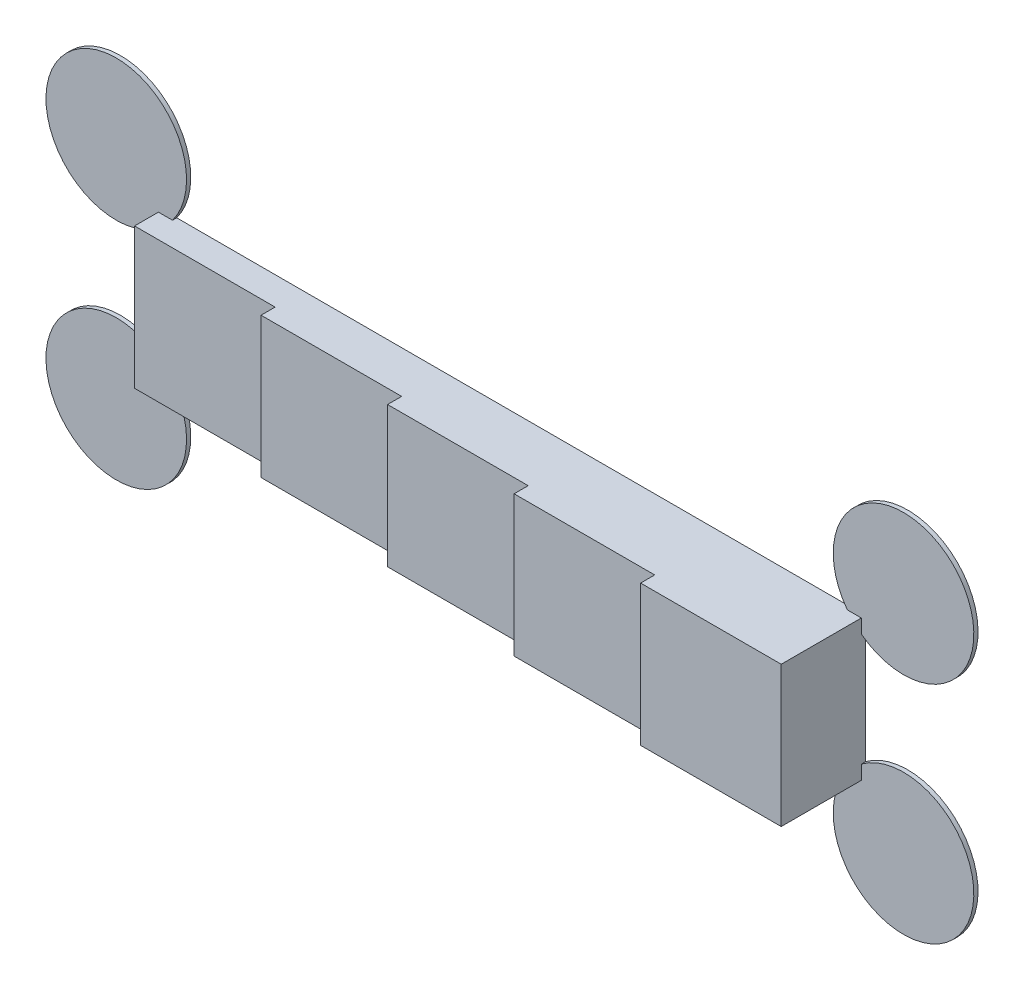
ISO-10303-21;
HEADER;
FILE_DESCRIPTION(('STEP AP214'),'2;1');
FILE_NAME('part.step','',(''),(''),'','','');
FILE_SCHEMA(('AUTOMOTIVE_DESIGN { 1 0 10303 214 1 1 1 1 }'));
ENDSEC;
DATA;
#1=APPLICATION_CONTEXT('core data for automotive mechanical design processes');
#2=APPLICATION_PROTOCOL_DEFINITION('international standard','automotive_design',2000,#1);
#3=PRODUCT_CONTEXT('',#1,'mechanical');
#4=PRODUCT('Part','Part','',(#3));
#5=PRODUCT_RELATED_PRODUCT_CATEGORY('part','',(#4));
#6=PRODUCT_DEFINITION_FORMATION('','',#4);
#7=PRODUCT_DEFINITION_CONTEXT('part definition',#1,'design');
#8=PRODUCT_DEFINITION('design','',#6,#7);
#9=PRODUCT_DEFINITION_SHAPE('','',#8);
#10=(LENGTH_UNIT() NAMED_UNIT(*) SI_UNIT(.MILLI.,.METRE.));
#11=(NAMED_UNIT(*) PLANE_ANGLE_UNIT() SI_UNIT($,.RADIAN.));
#12=(NAMED_UNIT(*) SI_UNIT($,.STERADIAN.) SOLID_ANGLE_UNIT());
#13=UNCERTAINTY_MEASURE_WITH_UNIT(LENGTH_MEASURE(1.E-05),#10,'distance_accuracy_value','');
#14=(GEOMETRIC_REPRESENTATION_CONTEXT(3) GLOBAL_UNCERTAINTY_ASSIGNED_CONTEXT((#13)) GLOBAL_UNIT_ASSIGNED_CONTEXT((#10,
#11,#12)) REPRESENTATION_CONTEXT('',''));
#15=CARTESIAN_POINT('',(0.,0.,0.));
#16=DIRECTION('',(0.,0.,1.));
#17=DIRECTION('',(1.,0.,0.));
#18=AXIS2_PLACEMENT_3D('',#15,#16,#17);
#19=CARTESIAN_POINT('',(0.,0.,5.));
#20=DIRECTION('',(0.,0.,-1.));
#21=DIRECTION('',(-1.,0.,0.));
#22=AXIS2_PLACEMENT_3D('',#19,#20,#21);
#23=PLANE('',#22);
#24=DIRECTION('',(0.,-1.,0.));
#25=VECTOR('',#24,1.);
#26=CARTESIAN_POINT('',(40.,10.,5.));
#27=LINE('',#26,#25);
#28=CARTESIAN_POINT('',(40.,10.,5.));
#29=VERTEX_POINT('',#28);
#30=CARTESIAN_POINT('',(40.,0.,5.));
#31=VERTEX_POINT('',#30);
#32=EDGE_CURVE('E233',#29,#31,#27,.T.);
#33=ORIENTED_EDGE('',*,*,#32,.F.);
#34=DIRECTION('',(-1.,0.,0.));
#35=VECTOR('',#34,1.);
#36=CARTESIAN_POINT('',(50.,10.,5.));
#37=LINE('',#36,#35);
#38=CARTESIAN_POINT('',(30.,10.,5.));
#39=VERTEX_POINT('',#38);
#40=EDGE_CURVE('E289',#29,#39,#37,.T.);
#41=ORIENTED_EDGE('',*,*,#40,.T.);
#42=DIRECTION('',(0.,-1.,0.));
#43=VECTOR('',#42,1.);
#44=CARTESIAN_POINT('',(30.,10.,5.));
#45=LINE('',#44,#43);
#46=CARTESIAN_POINT('',(30.,0.,5.));
#47=VERTEX_POINT('',#46);
#48=EDGE_CURVE('E303',#39,#47,#45,.T.);
#49=ORIENTED_EDGE('',*,*,#48,.T.);
#50=DIRECTION('',(1.,0.,0.));
#51=VECTOR('',#50,1.);
#52=CARTESIAN_POINT('',(50.,0.,5.));
#53=LINE('',#52,#51);
#54=EDGE_CURVE('E299',#47,#31,#53,.T.);
#55=ORIENTED_EDGE('',*,*,#54,.T.);
#56=EDGE_LOOP('',(#33,#41,#49,#55));
#57=FACE_BOUND('',#56,.T.);
#58=ADVANCED_FACE('F33',(#57),#23,.F.);
#59=CARTESIAN_POINT('',(0.,0.,4.));
#60=DIRECTION('',(0.,0.,-1.));
#61=DIRECTION('',(-1.,0.,0.));
#62=AXIS2_PLACEMENT_3D('',#59,#60,#61);
#63=PLANE('',#62);
#64=DIRECTION('',(0.,-1.,0.));
#65=VECTOR('',#64,1.);
#66=CARTESIAN_POINT('',(30.,10.,4.));
#67=LINE('',#66,#65);
#68=CARTESIAN_POINT('',(30.,10.,4.));
#69=VERTEX_POINT('',#68);
#70=CARTESIAN_POINT('',(30.,0.,4.));
#71=VERTEX_POINT('',#70);
#72=EDGE_CURVE('E295',#69,#71,#67,.T.);
#73=ORIENTED_EDGE('',*,*,#72,.F.);
#74=DIRECTION('',(-1.,0.,0.));
#75=VECTOR('',#74,1.);
#76=CARTESIAN_POINT('',(50.,10.,4.));
#77=LINE('',#76,#75);
#78=CARTESIAN_POINT('',(20.,10.,4.));
#79=VERTEX_POINT('',#78);
#80=EDGE_CURVE('E327',#69,#79,#77,.T.);
#81=ORIENTED_EDGE('',*,*,#80,.T.);
#82=DIRECTION('',(0.,-1.,0.));
#83=VECTOR('',#82,1.);
#84=CARTESIAN_POINT('',(20.,10.,4.));
#85=LINE('',#84,#83);
#86=CARTESIAN_POINT('',(20.,0.,4.));
#87=VERTEX_POINT('',#86);
#88=EDGE_CURVE('E333',#79,#87,#85,.T.);
#89=ORIENTED_EDGE('',*,*,#88,.T.);
#90=DIRECTION('',(1.,0.,0.));
#91=VECTOR('',#90,1.);
#92=CARTESIAN_POINT('',(50.,0.,4.));
#93=LINE('',#92,#91);
#94=EDGE_CURVE('E313',#87,#71,#93,.T.);
#95=ORIENTED_EDGE('',*,*,#94,.T.);
#96=EDGE_LOOP('',(#73,#81,#89,#95));
#97=FACE_BOUND('',#96,.T.);
#98=ADVANCED_FACE('F423',(#97),#63,.F.);
#99=CARTESIAN_POINT('',(0.,0.,3.));
#100=DIRECTION('',(0.,0.,-1.));
#101=DIRECTION('',(-1.,0.,0.));
#102=AXIS2_PLACEMENT_3D('',#99,#100,#101);
#103=PLANE('',#102);
#104=DIRECTION('',(0.,-1.,0.));
#105=VECTOR('',#104,1.);
#106=CARTESIAN_POINT('',(20.,10.,3.));
#107=LINE('',#106,#105);
#108=CARTESIAN_POINT('',(20.,9.99999999999999,3.));
#109=VERTEX_POINT('',#108);
#110=CARTESIAN_POINT('',(20.,0.,3.));
#111=VERTEX_POINT('',#110);
#112=EDGE_CURVE('E322',#109,#111,#107,.T.);
#113=ORIENTED_EDGE('',*,*,#112,.F.);
#114=DIRECTION('',(-1.,0.,0.));
#115=VECTOR('',#114,1.);
#116=CARTESIAN_POINT('',(50.,10.,3.));
#117=LINE('',#116,#115);
#118=CARTESIAN_POINT('',(10.,9.99999999999999,3.));
#119=VERTEX_POINT('',#118);
#120=EDGE_CURVE('E348',#109,#119,#117,.T.);
#121=ORIENTED_EDGE('',*,*,#120,.T.);
#122=DIRECTION('',(0.,-1.,0.));
#123=VECTOR('',#122,1.);
#124=CARTESIAN_POINT('',(10.,9.99999999999999,3.));
#125=LINE('',#124,#123);
#126=CARTESIAN_POINT('',(10.,0.,3.));
#127=VERTEX_POINT('',#126);
#128=EDGE_CURVE('E347',#119,#127,#125,.T.);
#129=ORIENTED_EDGE('',*,*,#128,.T.);
#130=DIRECTION('',(1.,0.,0.));
#131=VECTOR('',#130,1.);
#132=CARTESIAN_POINT('',(50.,0.,3.));
#133=LINE('',#132,#131);
#134=EDGE_CURVE('E337',#127,#111,#133,.T.);
#135=ORIENTED_EDGE('',*,*,#134,.T.);
#136=EDGE_LOOP('',(#113,#121,#129,#135));
#137=FACE_BOUND('',#136,.T.);
#138=ADVANCED_FACE('F429',(#137),#103,.F.);
#139=CARTESIAN_POINT('',(0.,0.,2.));
#140=DIRECTION('',(0.,0.,-1.));
#141=DIRECTION('',(-1.,0.,0.));
#142=AXIS2_PLACEMENT_3D('',#139,#140,#141);
#143=PLANE('',#142);
#144=DIRECTION('',(0.,-1.,0.));
#145=VECTOR('',#144,1.);
#146=CARTESIAN_POINT('',(10.,9.99999999999999,2.));
#147=LINE('',#146,#145);
#148=CARTESIAN_POINT('',(10.,10.,2.));
#149=VERTEX_POINT('',#148);
#150=CARTESIAN_POINT('',(10.,0.,2.));
#151=VERTEX_POINT('',#150);
#152=EDGE_CURVE('E350',#149,#151,#147,.T.);
#153=ORIENTED_EDGE('',*,*,#152,.F.);
#154=DIRECTION('',(-1.,0.,0.));
#155=VECTOR('',#154,1.);
#156=CARTESIAN_POINT('',(0.,10.,2.));
#157=LINE('',#156,#155);
#158=CARTESIAN_POINT('',(0.,10.,2.));
#159=VERTEX_POINT('',#158);
#160=EDGE_CURVE('E366',#149,#159,#157,.T.);
#161=ORIENTED_EDGE('',*,*,#160,.T.);
#162=DIRECTION('',(0.,-1.,0.));
#163=VECTOR('',#162,1.);
#164=CARTESIAN_POINT('',(0.,0.,2.));
#165=LINE('',#164,#163);
#166=CARTESIAN_POINT('',(0.,0.,2.));
#167=VERTEX_POINT('',#166);
#168=EDGE_CURVE('E372',#159,#167,#165,.T.);
#169=ORIENTED_EDGE('',*,*,#168,.T.);
#170=DIRECTION('',(1.,0.,0.));
#171=VECTOR('',#170,1.);
#172=CARTESIAN_POINT('',(0.,0.,2.));
#173=LINE('',#172,#171);
#174=EDGE_CURVE('E375',#167,#151,#173,.T.);
#175=ORIENTED_EDGE('',*,*,#174,.T.);
#176=EDGE_LOOP('',(#153,#161,#169,#175));
#177=FACE_BOUND('',#176,.T.);
#178=ADVANCED_FACE('F404',(#177),#143,.F.);
#179=CARTESIAN_POINT('',(0.,0.,2.));
#180=DIRECTION('',(1.,0.,0.));
#181=DIRECTION('',(0.,0.,-1.));
#182=AXIS2_PLACEMENT_3D('',#179,#180,#181);
#183=PLANE('',#182);
#184=DIRECTION('',(0.,1.,0.));
#185=VECTOR('',#184,1.);
#186=CARTESIAN_POINT('',(0.,0.,0.3));
#187=LINE('',#186,#185);
#188=CARTESIAN_POINT('',(0.,9.,0.3));
#189=VERTEX_POINT('',#188);
#190=CARTESIAN_POINT('',(0.,10.,0.3));
#191=VERTEX_POINT('',#190);
#192=EDGE_CURVE('E216',#189,#191,#187,.T.);
#193=ORIENTED_EDGE('',*,*,#192,.F.);
#194=DIRECTION('',(0.,0.,-1.));
#195=VECTOR('',#194,1.);
#196=CARTESIAN_POINT('',(0.,9.,0.3));
#197=LINE('',#196,#195);
#198=CARTESIAN_POINT('',(0.,9.,0.));
#199=VERTEX_POINT('',#198);
#200=EDGE_CURVE('E214',#189,#199,#197,.T.);
#201=ORIENTED_EDGE('',*,*,#200,.T.);
#202=DIRECTION('',(0.,-1.,0.));
#203=VECTOR('',#202,1.);
#204=CARTESIAN_POINT('',(0.,0.,0.));
#205=LINE('',#204,#203);
#206=CARTESIAN_POINT('',(0.,0.999999999999999,0.));
#207=VERTEX_POINT('',#206);
#208=EDGE_CURVE('E356',#199,#207,#205,.T.);
#209=ORIENTED_EDGE('',*,*,#208,.T.);
#210=DIRECTION('',(0.,0.,-1.));
#211=VECTOR('',#210,1.);
#212=CARTESIAN_POINT('',(0.,0.999999999999999,0.3));
#213=LINE('',#212,#211);
#214=CARTESIAN_POINT('',(0.,0.999999999999999,0.3));
#215=VERTEX_POINT('',#214);
#216=EDGE_CURVE('E228',#207,#215,#213,.F.);
#217=ORIENTED_EDGE('',*,*,#216,.T.);
#218=DIRECTION('',(0.,1.,0.));
#219=VECTOR('',#218,1.);
#220=CARTESIAN_POINT('',(0.,0.,0.3));
#221=LINE('',#220,#219);
#222=CARTESIAN_POINT('',(0.,0.,0.3));
#223=VERTEX_POINT('',#222);
#224=EDGE_CURVE('E230',#223,#215,#221,.T.);
#225=ORIENTED_EDGE('',*,*,#224,.F.);
#226=DIRECTION('',(0.,0.,-1.));
#227=VECTOR('',#226,1.);
#228=CARTESIAN_POINT('',(0.,0.,2.));
#229=LINE('',#228,#227);
#230=EDGE_CURVE('E265',#167,#223,#229,.T.);
#231=ORIENTED_EDGE('',*,*,#230,.F.);
#232=ORIENTED_EDGE('',*,*,#168,.F.);
#233=DIRECTION('',(0.,0.,-1.));
#234=VECTOR('',#233,1.);
#235=CARTESIAN_POINT('',(0.,10.,2.));
#236=LINE('',#235,#234);
#237=EDGE_CURVE('E281',#159,#191,#236,.T.);
#238=ORIENTED_EDGE('',*,*,#237,.T.);
#239=EDGE_LOOP('',(#193,#201,#209,#217,#225,#231,#232,#238));
#240=FACE_BOUND('',#239,.T.);
#241=ADVANCED_FACE('F35',(#240),#183,.F.);
#242=CARTESIAN_POINT('',(0.,0.,2.));
#243=DIRECTION('',(0.,1.,0.));
#244=DIRECTION('',(0.,0.,1.));
#245=AXIS2_PLACEMENT_3D('',#242,#243,#244);
#246=PLANE('',#245);
#247=DIRECTION('',(1.,0.,0.));
#248=VECTOR('',#247,1.);
#249=CARTESIAN_POINT('',(0.,0.,0.));
#250=LINE('',#249,#248);
#251=CARTESIAN_POINT('',(0.999999999999999,0.,0.));
#252=VERTEX_POINT('',#251);
#253=CARTESIAN_POINT('',(49.,0.,0.));
#254=VERTEX_POINT('',#253);
#255=EDGE_CURVE('E178',#252,#254,#250,.T.);
#256=ORIENTED_EDGE('',*,*,#255,.T.);
#257=DIRECTION('',(0.,0.,-1.));
#258=VECTOR('',#257,1.);
#259=CARTESIAN_POINT('',(49.,0.,0.3));
#260=LINE('',#259,#258);
#261=CARTESIAN_POINT('',(49.,0.,0.3));
#262=VERTEX_POINT('',#261);
#263=EDGE_CURVE('E48',#254,#262,#260,.F.);
#264=ORIENTED_EDGE('',*,*,#263,.T.);
#265=DIRECTION('',(-1.,0.,0.));
#266=VECTOR('',#265,1.);
#267=CARTESIAN_POINT('',(0.,0.,0.3));
#268=LINE('',#267,#266);
#269=CARTESIAN_POINT('',(50.,0.,0.3));
#270=VERTEX_POINT('',#269);
#271=EDGE_CURVE('E192',#270,#262,#268,.T.);
#272=ORIENTED_EDGE('',*,*,#271,.F.);
#273=DIRECTION('',(0.,0.,-1.));
#274=VECTOR('',#273,1.);
#275=CARTESIAN_POINT('',(50.,0.,2.));
#276=LINE('',#275,#274);
#277=CARTESIAN_POINT('',(50.,0.,6.));
#278=VERTEX_POINT('',#277);
#279=EDGE_CURVE('E280',#278,#270,#276,.T.);
#280=ORIENTED_EDGE('',*,*,#279,.F.);
#281=DIRECTION('',(1.,0.,0.));
#282=VECTOR('',#281,1.);
#283=CARTESIAN_POINT('',(40.,0.,6.));
#284=LINE('',#283,#282);
#285=CARTESIAN_POINT('',(40.,0.,6.));
#286=VERTEX_POINT('',#285);
#287=EDGE_CURVE('E237',#286,#278,#284,.T.);
#288=ORIENTED_EDGE('',*,*,#287,.F.);
#289=DIRECTION('',(0.,0.,-1.));
#290=VECTOR('',#289,1.);
#291=CARTESIAN_POINT('',(40.,0.,6.));
#292=LINE('',#291,#290);
#293=EDGE_CURVE('E258',#286,#31,#292,.T.);
#294=ORIENTED_EDGE('',*,*,#293,.T.);
#295=ORIENTED_EDGE('',*,*,#54,.F.);
#296=DIRECTION('',(0.,0.,-1.));
#297=VECTOR('',#296,1.);
#298=CARTESIAN_POINT('',(30.,0.,5.));
#299=LINE('',#298,#297);
#300=EDGE_CURVE('E302',#47,#71,#299,.T.);
#301=ORIENTED_EDGE('',*,*,#300,.T.);
#302=ORIENTED_EDGE('',*,*,#94,.F.);
#303=DIRECTION('',(0.,0.,-1.));
#304=VECTOR('',#303,1.);
#305=CARTESIAN_POINT('',(20.,0.,4.));
#306=LINE('',#305,#304);
#307=EDGE_CURVE('E340',#87,#111,#306,.T.);
#308=ORIENTED_EDGE('',*,*,#307,.T.);
#309=ORIENTED_EDGE('',*,*,#134,.F.);
#310=DIRECTION('',(0.,0.,-1.));
#311=VECTOR('',#310,1.);
#312=CARTESIAN_POINT('',(10.,0.,3.));
#313=LINE('',#312,#311);
#314=EDGE_CURVE('E357',#127,#151,#313,.T.);
#315=ORIENTED_EDGE('',*,*,#314,.T.);
#316=ORIENTED_EDGE('',*,*,#174,.F.);
#317=ORIENTED_EDGE('',*,*,#230,.T.);
#318=DIRECTION('',(-1.,0.,0.));
#319=VECTOR('',#318,1.);
#320=CARTESIAN_POINT('',(0.,0.,0.3));
#321=LINE('',#320,#319);
#322=CARTESIAN_POINT('',(0.999999999999999,0.,0.3));
#323=VERTEX_POINT('',#322);
#324=EDGE_CURVE('E261',#323,#223,#321,.T.);
#325=ORIENTED_EDGE('',*,*,#324,.F.);
#326=DIRECTION('',(0.,0.,-1.));
#327=VECTOR('',#326,1.);
#328=CARTESIAN_POINT('',(0.999999999999999,0.,0.3));
#329=LINE('',#328,#327);
#330=EDGE_CURVE('E223',#323,#252,#329,.T.);
#331=ORIENTED_EDGE('',*,*,#330,.T.);
#332=EDGE_LOOP('',(#256,#264,#272,#280,#288,#294,#295,#301,#302,#308,#309,#315,#316,#317,#325,#331));
#333=FACE_BOUND('',#332,.T.);
#334=ADVANCED_FACE('F396',(#333),#246,.F.);
#335=CARTESIAN_POINT('',(50.,0.,2.));
#336=DIRECTION('',(-1.,0.,0.));
#337=DIRECTION('',(0.,0.,1.));
#338=AXIS2_PLACEMENT_3D('',#335,#336,#337);
#339=PLANE('',#338);
#340=DIRECTION('',(0.,-1.,0.));
#341=VECTOR('',#340,1.);
#342=CARTESIAN_POINT('',(50.,0.,0.3));
#343=LINE('',#342,#341);
#344=CARTESIAN_POINT('',(50.,0.999999999999999,0.3));
#345=VERTEX_POINT('',#344);
#346=EDGE_CURVE('E11',#345,#270,#343,.T.);
#347=ORIENTED_EDGE('',*,*,#346,.F.);
#348=DIRECTION('',(0.,0.,-1.));
#349=VECTOR('',#348,1.);
#350=CARTESIAN_POINT('',(50.,0.999999999999999,0.3));
#351=LINE('',#350,#349);
#352=CARTESIAN_POINT('',(50.,0.999999999999999,0.));
#353=VERTEX_POINT('',#352);
#354=EDGE_CURVE('E180',#345,#353,#351,.T.);
#355=ORIENTED_EDGE('',*,*,#354,.T.);
#356=DIRECTION('',(0.,1.,0.));
#357=VECTOR('',#356,1.);
#358=CARTESIAN_POINT('',(50.,0.,0.));
#359=LINE('',#358,#357);
#360=CARTESIAN_POINT('',(50.,9.,0.));
#361=VERTEX_POINT('',#360);
#362=EDGE_CURVE('E170',#353,#361,#359,.T.);
#363=ORIENTED_EDGE('',*,*,#362,.T.);
#364=DIRECTION('',(0.,0.,-1.));
#365=VECTOR('',#364,1.);
#366=CARTESIAN_POINT('',(50.,9.,0.3));
#367=LINE('',#366,#365);
#368=CARTESIAN_POINT('',(50.,9.,0.3));
#369=VERTEX_POINT('',#368);
#370=EDGE_CURVE('E201',#361,#369,#367,.F.);
#371=ORIENTED_EDGE('',*,*,#370,.T.);
#372=DIRECTION('',(0.,-1.,0.));
#373=VECTOR('',#372,1.);
#374=CARTESIAN_POINT('',(50.,0.,0.3));
#375=LINE('',#374,#373);
#376=CARTESIAN_POINT('',(50.,10.,0.3));
#377=VERTEX_POINT('',#376);
#378=EDGE_CURVE('E203',#377,#369,#375,.T.);
#379=ORIENTED_EDGE('',*,*,#378,.F.);
#380=DIRECTION('',(0.,0.,-1.));
#381=VECTOR('',#380,1.);
#382=CARTESIAN_POINT('',(50.,10.,2.));
#383=LINE('',#382,#381);
#384=CARTESIAN_POINT('',(50.,10.,6.));
#385=VERTEX_POINT('',#384);
#386=EDGE_CURVE('E276',#385,#377,#383,.T.);
#387=ORIENTED_EDGE('',*,*,#386,.F.);
#388=DIRECTION('',(0.,1.,0.));
#389=VECTOR('',#388,1.);
#390=CARTESIAN_POINT('',(50.,10.,6.));
#391=LINE('',#390,#389);
#392=EDGE_CURVE('E240',#278,#385,#391,.T.);
#393=ORIENTED_EDGE('',*,*,#392,.F.);
#394=ORIENTED_EDGE('',*,*,#279,.T.);
#395=EDGE_LOOP('',(#347,#355,#363,#371,#379,#387,#393,#394));
#396=FACE_BOUND('',#395,.T.);
#397=ADVANCED_FACE('F181',(#396),#339,.F.);
#398=CARTESIAN_POINT('',(0.,10.,2.));
#399=DIRECTION('',(0.,-1.,0.));
#400=DIRECTION('',(0.,0.,-1.));
#401=AXIS2_PLACEMENT_3D('',#398,#399,#400);
#402=PLANE('',#401);
#403=DIRECTION('',(1.,0.,0.));
#404=VECTOR('',#403,1.);
#405=CARTESIAN_POINT('',(0.,10.,0.3));
#406=LINE('',#405,#404);
#407=CARTESIAN_POINT('',(49.,10.,0.3));
#408=VERTEX_POINT('',#407);
#409=EDGE_CURVE('E41',#408,#377,#406,.T.);
#410=ORIENTED_EDGE('',*,*,#409,.F.);
#411=DIRECTION('',(0.,0.,-1.));
#412=VECTOR('',#411,1.);
#413=CARTESIAN_POINT('',(49.,10.,0.3));
#414=LINE('',#413,#412);
#415=CARTESIAN_POINT('',(49.,10.,0.));
#416=VERTEX_POINT('',#415);
#417=EDGE_CURVE('E197',#408,#416,#414,.T.);
#418=ORIENTED_EDGE('',*,*,#417,.T.);
#419=DIRECTION('',(-1.,0.,0.));
#420=VECTOR('',#419,1.);
#421=CARTESIAN_POINT('',(0.,10.,0.));
#422=LINE('',#421,#420);
#423=CARTESIAN_POINT('',(1.,10.,0.));
#424=VERTEX_POINT('',#423);
#425=EDGE_CURVE('E177',#416,#424,#422,.T.);
#426=ORIENTED_EDGE('',*,*,#425,.T.);
#427=DIRECTION('',(0.,0.,-1.));
#428=VECTOR('',#427,1.);
#429=CARTESIAN_POINT('',(1.,10.,0.3));
#430=LINE('',#429,#428);
#431=CARTESIAN_POINT('',(1.,10.,0.3));
#432=VERTEX_POINT('',#431);
#433=EDGE_CURVE('E210',#424,#432,#430,.F.);
#434=ORIENTED_EDGE('',*,*,#433,.T.);
#435=DIRECTION('',(1.,0.,0.));
#436=VECTOR('',#435,1.);
#437=CARTESIAN_POINT('',(0.,10.,0.3));
#438=LINE('',#437,#436);
#439=EDGE_CURVE('E264',#191,#432,#438,.T.);
#440=ORIENTED_EDGE('',*,*,#439,.F.);
#441=ORIENTED_EDGE('',*,*,#237,.F.);
#442=ORIENTED_EDGE('',*,*,#160,.F.);
#443=DIRECTION('',(0.,0.,-1.));
#444=VECTOR('',#443,1.);
#445=CARTESIAN_POINT('',(10.,9.99999999999999,3.));
#446=LINE('',#445,#444);
#447=EDGE_CURVE('E353',#119,#149,#446,.T.);
#448=ORIENTED_EDGE('',*,*,#447,.F.);
#449=ORIENTED_EDGE('',*,*,#120,.F.);
#450=DIRECTION('',(0.,0.,-1.));
#451=VECTOR('',#450,1.);
#452=CARTESIAN_POINT('',(20.,10.,4.));
#453=LINE('',#452,#451);
#454=EDGE_CURVE('E365',#79,#109,#453,.T.);
#455=ORIENTED_EDGE('',*,*,#454,.F.);
#456=ORIENTED_EDGE('',*,*,#80,.F.);
#457=DIRECTION('',(0.,0.,-1.));
#458=VECTOR('',#457,1.);
#459=CARTESIAN_POINT('',(30.,10.,5.));
#460=LINE('',#459,#458);
#461=EDGE_CURVE('E318',#39,#69,#460,.T.);
#462=ORIENTED_EDGE('',*,*,#461,.F.);
#463=ORIENTED_EDGE('',*,*,#40,.F.);
#464=DIRECTION('',(0.,0.,-1.));
#465=VECTOR('',#464,1.);
#466=CARTESIAN_POINT('',(40.,10.,6.));
#467=LINE('',#466,#465);
#468=CARTESIAN_POINT('',(40.,10.,6.));
#469=VERTEX_POINT('',#468);
#470=EDGE_CURVE('E245',#469,#29,#467,.T.);
#471=ORIENTED_EDGE('',*,*,#470,.F.);
#472=DIRECTION('',(-1.,0.,0.));
#473=VECTOR('',#472,1.);
#474=CARTESIAN_POINT('',(40.,10.,6.));
#475=LINE('',#474,#473);
#476=EDGE_CURVE('E243',#385,#469,#475,.T.);
#477=ORIENTED_EDGE('',*,*,#476,.F.);
#478=ORIENTED_EDGE('',*,*,#386,.T.);
#479=EDGE_LOOP('',(#410,#418,#426,#434,#440,#441,#442,#448,#449,#455,#456,#462,#463,#471,#477,#478));
#480=FACE_BOUND('',#479,.T.);
#481=ADVANCED_FACE('F274',(#480),#402,.F.);
#482=CARTESIAN_POINT('',(0.,0.,0.));
#483=DIRECTION('',(0.,0.,-1.));
#484=DIRECTION('',(-1.,0.,0.));
#485=AXIS2_PLACEMENT_3D('',#482,#483,#484);
#486=PLANE('',#485);
#487=ORIENTED_EDGE('',*,*,#362,.F.);
#488=CARTESIAN_POINT('',(53.,-3.,0.));
#489=DIRECTION('',(0.,0.,-1.));
#490=DIRECTION('',(-1.,0.,0.));
#491=AXIS2_PLACEMENT_3D('',#488,#489,#490);
#492=CIRCLE('',#491,5.);
#493=EDGE_CURVE('E173',#353,#254,#492,.T.);
#494=ORIENTED_EDGE('',*,*,#493,.T.);
#495=ORIENTED_EDGE('',*,*,#255,.F.);
#496=CARTESIAN_POINT('',(-3.,-3.,0.));
#497=DIRECTION('',(0.,0.,-1.));
#498=DIRECTION('',(-1.,0.,0.));
#499=AXIS2_PLACEMENT_3D('',#496,#497,#498);
#500=CIRCLE('',#499,5.);
#501=EDGE_CURVE('E219',#252,#207,#500,.T.);
#502=ORIENTED_EDGE('',*,*,#501,.T.);
#503=ORIENTED_EDGE('',*,*,#208,.F.);
#504=CARTESIAN_POINT('',(-3.,13.,0.));
#505=DIRECTION('',(0.,0.,-1.));
#506=DIRECTION('',(-1.,0.,0.));
#507=AXIS2_PLACEMENT_3D('',#504,#505,#506);
#508=CIRCLE('',#507,5.);
#509=EDGE_CURVE('E206',#199,#424,#508,.T.);
#510=ORIENTED_EDGE('',*,*,#509,.T.);
#511=ORIENTED_EDGE('',*,*,#425,.F.);
#512=CARTESIAN_POINT('',(53.,13.,0.));
#513=DIRECTION('',(0.,0.,-1.));
#514=DIRECTION('',(-1.,0.,0.));
#515=AXIS2_PLACEMENT_3D('',#512,#513,#514);
#516=CIRCLE('',#515,5.);
#517=EDGE_CURVE('E175',#416,#361,#516,.T.);
#518=ORIENTED_EDGE('',*,*,#517,.T.);
#519=EDGE_LOOP('',(#487,#494,#495,#502,#503,#510,#511,#518));
#520=FACE_BOUND('',#519,.T.);
#521=ADVANCED_FACE('F171',(#520),#486,.T.);
#522=CARTESIAN_POINT('',(10.,9.99999999999999,3.));
#523=DIRECTION('',(1.,0.,0.));
#524=DIRECTION('',(0.,1.,0.));
#525=AXIS2_PLACEMENT_3D('',#522,#523,#524);
#526=PLANE('',#525);
#527=ORIENTED_EDGE('',*,*,#152,.T.);
#528=ORIENTED_EDGE('',*,*,#314,.F.);
#529=ORIENTED_EDGE('',*,*,#128,.F.);
#530=ORIENTED_EDGE('',*,*,#447,.T.);
#531=EDGE_LOOP('',(#527,#528,#529,#530));
#532=FACE_BOUND('',#531,.T.);
#533=ADVANCED_FACE('F441',(#532),#526,.F.);
#534=CARTESIAN_POINT('',(20.,10.,4.));
#535=DIRECTION('',(1.,0.,0.));
#536=DIRECTION('',(0.,0.,-1.));
#537=AXIS2_PLACEMENT_3D('',#534,#535,#536);
#538=PLANE('',#537);
#539=ORIENTED_EDGE('',*,*,#112,.T.);
#540=ORIENTED_EDGE('',*,*,#307,.F.);
#541=ORIENTED_EDGE('',*,*,#88,.F.);
#542=ORIENTED_EDGE('',*,*,#454,.T.);
#543=EDGE_LOOP('',(#539,#540,#541,#542));
#544=FACE_BOUND('',#543,.T.);
#545=ADVANCED_FACE('F437',(#544),#538,.F.);
#546=CARTESIAN_POINT('',(30.,10.,5.));
#547=DIRECTION('',(1.,0.,0.));
#548=DIRECTION('',(0.,1.,0.));
#549=AXIS2_PLACEMENT_3D('',#546,#547,#548);
#550=PLANE('',#549);
#551=ORIENTED_EDGE('',*,*,#72,.T.);
#552=ORIENTED_EDGE('',*,*,#300,.F.);
#553=ORIENTED_EDGE('',*,*,#48,.F.);
#554=ORIENTED_EDGE('',*,*,#461,.T.);
#555=EDGE_LOOP('',(#551,#552,#553,#554));
#556=FACE_BOUND('',#555,.T.);
#557=ADVANCED_FACE('F435',(#556),#550,.F.);
#558=CARTESIAN_POINT('',(40.,10.,6.));
#559=DIRECTION('',(1.,0.,0.));
#560=DIRECTION('',(0.,0.,-1.));
#561=AXIS2_PLACEMENT_3D('',#558,#559,#560);
#562=PLANE('',#561);
#563=ORIENTED_EDGE('',*,*,#32,.T.);
#564=ORIENTED_EDGE('',*,*,#293,.F.);
#565=DIRECTION('',(0.,-1.,0.));
#566=VECTOR('',#565,1.);
#567=CARTESIAN_POINT('',(40.,10.,6.));
#568=LINE('',#567,#566);
#569=EDGE_CURVE('E234',#469,#286,#568,.T.);
#570=ORIENTED_EDGE('',*,*,#569,.F.);
#571=ORIENTED_EDGE('',*,*,#470,.T.);
#572=EDGE_LOOP('',(#563,#564,#570,#571));
#573=FACE_BOUND('',#572,.T.);
#574=ADVANCED_FACE('F292',(#573),#562,.F.);
#575=CARTESIAN_POINT('',(0.,0.,6.));
#576=DIRECTION('',(0.,0.,1.));
#577=DIRECTION('',(1.,0.,0.));
#578=AXIS2_PLACEMENT_3D('',#575,#576,#577);
#579=PLANE('',#578);
#580=ORIENTED_EDGE('',*,*,#569,.T.);
#581=ORIENTED_EDGE('',*,*,#287,.T.);
#582=ORIENTED_EDGE('',*,*,#392,.T.);
#583=ORIENTED_EDGE('',*,*,#476,.T.);
#584=EDGE_LOOP('',(#580,#581,#582,#583));
#585=FACE_BOUND('',#584,.T.);
#586=ADVANCED_FACE('F284',(#585),#579,.T.);
#587=CARTESIAN_POINT('',(-3.,-3.,0.3));
#588=DIRECTION('',(0.,0.,-1.));
#589=DIRECTION('',(-1.,0.,0.));
#590=AXIS2_PLACEMENT_3D('',#587,#588,#589);
#591=PLANE('',#590);
#592=ORIENTED_EDGE('',*,*,#324,.T.);
#593=ORIENTED_EDGE('',*,*,#224,.T.);
#594=CARTESIAN_POINT('',(-3.,-3.,0.3));
#595=DIRECTION('',(0.,0.,-1.));
#596=DIRECTION('',(-1.,0.,0.));
#597=AXIS2_PLACEMENT_3D('',#594,#595,#596);
#598=CIRCLE('',#597,5.);
#599=EDGE_CURVE('E220',#323,#215,#598,.T.);
#600=ORIENTED_EDGE('',*,*,#599,.F.);
#601=EDGE_LOOP('',(#592,#593,#600));
#602=FACE_BOUND('',#601,.T.);
#603=ADVANCED_FACE('F398',(#602),#591,.F.);
#604=CARTESIAN_POINT('',(-3.,-3.,0.3));
#605=DIRECTION('',(0.,0.,-1.));
#606=DIRECTION('',(-1.,0.,0.));
#607=AXIS2_PLACEMENT_3D('',#604,#605,#606);
#608=CYLINDRICAL_SURFACE('',#607,5.);
#609=ORIENTED_EDGE('',*,*,#216,.F.);
#610=ORIENTED_EDGE('',*,*,#501,.F.);
#611=ORIENTED_EDGE('',*,*,#330,.F.);
#612=ORIENTED_EDGE('',*,*,#599,.T.);
#613=EDGE_LOOP('',(#609,#610,#611,#612));
#614=FACE_BOUND('',#613,.T.);
#615=ADVANCED_FACE('F393',(#614),#608,.T.);
#616=CARTESIAN_POINT('',(-3.,13.,0.3));
#617=DIRECTION('',(0.,0.,-1.));
#618=DIRECTION('',(-1.,0.,0.));
#619=AXIS2_PLACEMENT_3D('',#616,#617,#618);
#620=PLANE('',#619);
#621=CARTESIAN_POINT('',(-3.,13.,0.3));
#622=DIRECTION('',(0.,0.,-1.));
#623=DIRECTION('',(-1.,0.,0.));
#624=AXIS2_PLACEMENT_3D('',#621,#622,#623);
#625=CIRCLE('',#624,5.);
#626=EDGE_CURVE('E207',#189,#432,#625,.T.);
#627=ORIENTED_EDGE('',*,*,#626,.F.);
#628=ORIENTED_EDGE('',*,*,#192,.T.);
#629=ORIENTED_EDGE('',*,*,#439,.T.);
#630=EDGE_LOOP('',(#627,#628,#629));
#631=FACE_BOUND('',#630,.T.);
#632=ADVANCED_FACE('F409',(#631),#620,.F.);
#633=CARTESIAN_POINT('',(-3.,13.,0.3));
#634=DIRECTION('',(0.,0.,-1.));
#635=DIRECTION('',(-1.,0.,0.));
#636=AXIS2_PLACEMENT_3D('',#633,#634,#635);
#637=CYLINDRICAL_SURFACE('',#636,5.);
#638=ORIENTED_EDGE('',*,*,#200,.F.);
#639=ORIENTED_EDGE('',*,*,#626,.T.);
#640=ORIENTED_EDGE('',*,*,#433,.F.);
#641=ORIENTED_EDGE('',*,*,#509,.F.);
#642=EDGE_LOOP('',(#638,#639,#640,#641));
#643=FACE_BOUND('',#642,.T.);
#644=ADVANCED_FACE('F412',(#643),#637,.T.);
#645=CARTESIAN_POINT('',(53.,13.,0.3));
#646=DIRECTION('',(0.,0.,-1.));
#647=DIRECTION('',(-1.,0.,0.));
#648=AXIS2_PLACEMENT_3D('',#645,#646,#647);
#649=PLANE('',#648);
#650=ORIENTED_EDGE('',*,*,#409,.T.);
#651=ORIENTED_EDGE('',*,*,#378,.T.);
#652=CARTESIAN_POINT('',(53.,13.,0.3));
#653=DIRECTION('',(0.,0.,-1.));
#654=DIRECTION('',(-1.,0.,0.));
#655=AXIS2_PLACEMENT_3D('',#652,#653,#654);
#656=CIRCLE('',#655,5.);
#657=EDGE_CURVE('E194',#408,#369,#656,.T.);
#658=ORIENTED_EDGE('',*,*,#657,.F.);
#659=EDGE_LOOP('',(#650,#651,#658));
#660=FACE_BOUND('',#659,.T.);
#661=ADVANCED_FACE('F270',(#660),#649,.F.);
#662=CARTESIAN_POINT('',(53.,13.,0.3));
#663=DIRECTION('',(0.,0.,-1.));
#664=DIRECTION('',(-1.,0.,0.));
#665=AXIS2_PLACEMENT_3D('',#662,#663,#664);
#666=CYLINDRICAL_SURFACE('',#665,5.);
#667=ORIENTED_EDGE('',*,*,#370,.F.);
#668=ORIENTED_EDGE('',*,*,#517,.F.);
#669=ORIENTED_EDGE('',*,*,#417,.F.);
#670=ORIENTED_EDGE('',*,*,#657,.T.);
#671=EDGE_LOOP('',(#667,#668,#669,#670));
#672=FACE_BOUND('',#671,.T.);
#673=ADVANCED_FACE('F278',(#672),#666,.T.);
#674=CARTESIAN_POINT('',(53.,-3.,0.3));
#675=DIRECTION('',(0.,0.,-1.));
#676=DIRECTION('',(-1.,0.,0.));
#677=AXIS2_PLACEMENT_3D('',#674,#675,#676);
#678=PLANE('',#677);
#679=ORIENTED_EDGE('',*,*,#346,.T.);
#680=ORIENTED_EDGE('',*,*,#271,.T.);
#681=CARTESIAN_POINT('',(53.,-3.,0.3));
#682=DIRECTION('',(0.,0.,-1.));
#683=DIRECTION('',(-1.,0.,0.));
#684=AXIS2_PLACEMENT_3D('',#681,#682,#683);
#685=CIRCLE('',#684,5.);
#686=EDGE_CURVE('E185',#345,#262,#685,.T.);
#687=ORIENTED_EDGE('',*,*,#686,.F.);
#688=EDGE_LOOP('',(#679,#680,#687));
#689=FACE_BOUND('',#688,.T.);
#690=ADVANCED_FACE('F616',(#689),#678,.F.);
#691=CARTESIAN_POINT('',(53.,-3.,0.3));
#692=DIRECTION('',(0.,0.,-1.));
#693=DIRECTION('',(-1.,0.,0.));
#694=AXIS2_PLACEMENT_3D('',#691,#692,#693);
#695=CYLINDRICAL_SURFACE('',#694,5.);
#696=ORIENTED_EDGE('',*,*,#263,.F.);
#697=ORIENTED_EDGE('',*,*,#493,.F.);
#698=ORIENTED_EDGE('',*,*,#354,.F.);
#699=ORIENTED_EDGE('',*,*,#686,.T.);
#700=EDGE_LOOP('',(#696,#697,#698,#699));
#701=FACE_BOUND('',#700,.T.);
#702=ADVANCED_FACE('F187',(#701),#695,.T.);
#703=CLOSED_SHELL('',(#58,#98,#138,#178,#241,#334,#397,#481,#521,#533,#545,#557,#574,#586,#603,
#615,#632,#644,#661,#673,#690,#702));
#704=MANIFOLD_SOLID_BREP('B2',#703);
#705=ADVANCED_BREP_SHAPE_REPRESENTATION('',(#18,#704),#14);
#706=SHAPE_DEFINITION_REPRESENTATION(#9,#705);
ENDSEC;
END-ISO-10303-21;
